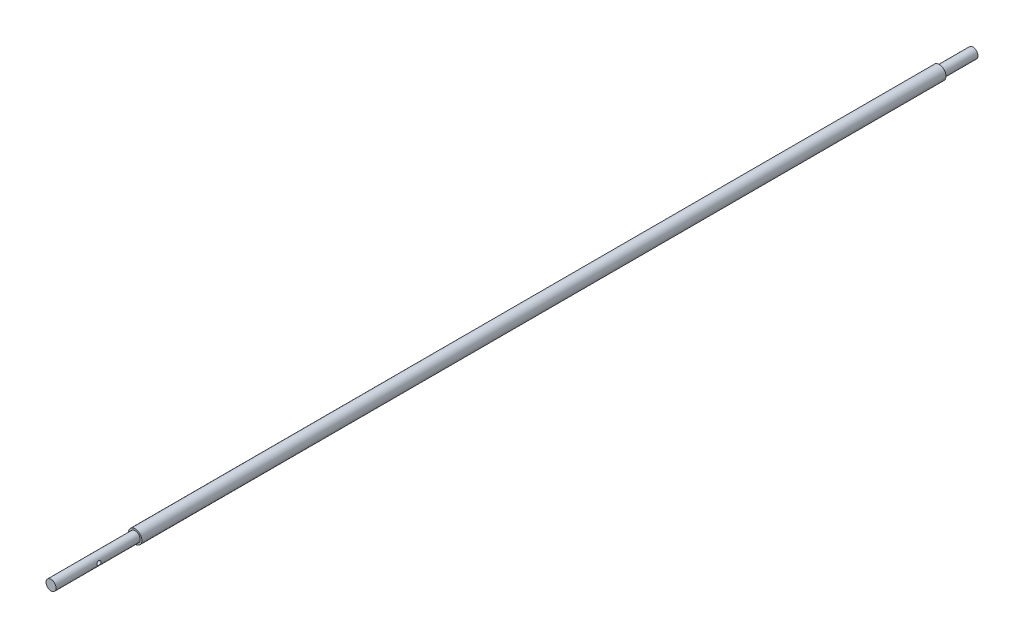
ISO-10303-21;
HEADER;
FILE_DESCRIPTION(('STEP AP214'),'2;1');
FILE_NAME('part.step','',(''),(''),'','','');
FILE_SCHEMA(('AUTOMOTIVE_DESIGN { 1 0 10303 214 1 1 1 1 }'));
ENDSEC;
DATA;
#1=APPLICATION_CONTEXT('core data for automotive mechanical design processes');
#2=APPLICATION_PROTOCOL_DEFINITION('international standard','automotive_design',2000,#1);
#3=PRODUCT_CONTEXT('',#1,'mechanical');
#4=PRODUCT('Part','Part','',(#3));
#5=PRODUCT_RELATED_PRODUCT_CATEGORY('part','',(#4));
#6=PRODUCT_DEFINITION_FORMATION('','',#4);
#7=PRODUCT_DEFINITION_CONTEXT('part definition',#1,'design');
#8=PRODUCT_DEFINITION('design','',#6,#7);
#9=PRODUCT_DEFINITION_SHAPE('','',#8);
#10=(LENGTH_UNIT() NAMED_UNIT(*) SI_UNIT(.MILLI.,.METRE.));
#11=(NAMED_UNIT(*) PLANE_ANGLE_UNIT() SI_UNIT($,.RADIAN.));
#12=(NAMED_UNIT(*) SI_UNIT($,.STERADIAN.) SOLID_ANGLE_UNIT());
#13=UNCERTAINTY_MEASURE_WITH_UNIT(LENGTH_MEASURE(1.E-05),#10,'distance_accuracy_value','');
#14=(GEOMETRIC_REPRESENTATION_CONTEXT(3) GLOBAL_UNCERTAINTY_ASSIGNED_CONTEXT((#13)) GLOBAL_UNIT_ASSIGNED_CONTEXT((#10,
#11,#12)) REPRESENTATION_CONTEXT('',''));
#15=CARTESIAN_POINT('',(0.,0.,0.));
#16=DIRECTION('',(0.,0.,1.));
#17=DIRECTION('',(1.,0.,0.));
#18=AXIS2_PLACEMENT_3D('',#15,#16,#17);
#19=CARTESIAN_POINT('',(0.,0.,90.));
#20=DIRECTION('',(0.,0.,1.));
#21=DIRECTION('',(1.,0.,0.));
#22=AXIS2_PLACEMENT_3D('',#19,#20,#21);
#23=PLANE('',#22);
#24=CARTESIAN_POINT('',(0.,0.,90.));
#25=DIRECTION('',(0.,0.,1.));
#26=DIRECTION('',(1.,0.,0.));
#27=AXIS2_PLACEMENT_3D('',#24,#25,#26);
#28=CIRCLE('',#27,3.);
#29=CARTESIAN_POINT('',(3.,0.,90.));
#30=VERTEX_POINT('',#29);
#31=EDGE_CURVE('E10',#30,#30,#28,.T.);
#32=ORIENTED_EDGE('',*,*,#31,.F.);
#33=EDGE_LOOP('',(#32));
#34=FACE_BOUND('',#33,.T.);
#35=ADVANCED_FACE('F16',(#34),#23,.F.);
#36=CARTESIAN_POINT('',(0.,0.,638.));
#37=DIRECTION('',(0.,0.,1.));
#38=DIRECTION('',(1.,0.,0.));
#39=AXIS2_PLACEMENT_3D('',#36,#37,#38);
#40=PLANE('',#39);
#41=CARTESIAN_POINT('',(0.,0.,638.));
#42=DIRECTION('',(0.,0.,1.));
#43=DIRECTION('',(1.,0.,0.));
#44=AXIS2_PLACEMENT_3D('',#41,#42,#43);
#45=CIRCLE('',#44,3.);
#46=CARTESIAN_POINT('',(3.,0.,638.));
#47=VERTEX_POINT('',#46);
#48=EDGE_CURVE('E50',#47,#47,#45,.T.);
#49=ORIENTED_EDGE('',*,*,#48,.T.);
#50=EDGE_LOOP('',(#49));
#51=FACE_BOUND('',#50,.T.);
#52=ADVANCED_FACE('F85',(#51),#40,.T.);
#53=CARTESIAN_POINT('',(-4.,0.,612.5));
#54=DIRECTION('',(1.,0.,0.));
#55=DIRECTION('',(0.,0.,1.));
#56=AXIS2_PLACEMENT_3D('',#53,#54,#55);
#57=CYLINDRICAL_SURFACE('',#56,1.25);
#58=CARTESIAN_POINT('',(3.,0.,611.25));
#59=CARTESIAN_POINT('',(3.,0.10405855664,611.25));
#60=CARTESIAN_POINT('',(2.995668678032,0.207578761754,611.26039506354));
#61=CARTESIAN_POINT('',(2.987090404886,0.308862616718,611.28098345168));
#62=CARTESIAN_POINT('',(2.974771547846,0.40625817689,611.31108311724));
#63=CARTESIAN_POINT('',(2.959613524117,0.498270751888,611.34953905804));
#64=CARTESIAN_POINT('',(2.935419056328,0.620244067277,611.41394989168));
#65=CARTESIAN_POINT('',(2.927824451843,0.655677243601,611.43451493087));
#66=CARTESIAN_POINT('',(2.919948248371,0.689971815887,611.45626751728));
#67=CARTESIAN_POINT('',(2.911854339085,0.72310091822,611.47912788189));
#68=CARTESIAN_POINT('',(2.903605619736,0.755042154729,611.50301795081));
#69=CARTESIAN_POINT('',(2.889301202292,0.807747989974,611.54561996494));
#70=CARTESIAN_POINT('',(2.883289935293,0.829105444796,611.5638683381));
#71=CARTESIAN_POINT('',(2.877251772947,0.849846247491,611.58258120506));
#72=CARTESIAN_POINT('',(2.871207460048,0.869967719327,611.60173481738));
#73=CARTESIAN_POINT('',(2.86517690089,0.889468219403,611.62130693783));
#74=CARTESIAN_POINT('',(2.84099468743,0.965585903217,611.70182331843));
#75=CARTESIAN_POINT('',(2.823109435877,1.017117648579,611.76603348901));
#76=CARTESIAN_POINT('',(2.80605468137,1.062915744244,611.83333282304));
#77=CARTESIAN_POINT('',(2.790300814279,1.102973119566,611.90322161812));
#78=CARTESIAN_POINT('',(2.776245698278,1.137286301073,611.97526644487));
#79=CARTESIAN_POINT('',(2.752405677325,1.193810943901,612.12141288428));
#80=CARTESIAN_POINT('',(2.74253943855,1.216254269432,612.19544248544));
#81=CARTESIAN_POINT('',(2.734917288729,1.233116524958,612.27073413251));
#82=CARTESIAN_POINT('',(2.729758358236,1.24436951182,612.34686162435));
#83=CARTESIAN_POINT('',(2.727178028659,1.25,612.42341554735));
#84=CARTESIAN_POINT('',(2.727178028659,1.25,612.57634846537));
#85=CARTESIAN_POINT('',(2.729742485352,1.244404156811,612.65266683399));
#86=CARTESIAN_POINT('',(2.734869700352,1.233220323494,612.7285626716));
#87=CARTESIAN_POINT('',(2.742445707314,1.216461606718,612.80363023076));
#88=CARTESIAN_POINT('',(2.752254004449,1.194155926755,612.87744723254));
#89=CARTESIAN_POINT('',(2.77588831852,1.138148224112,613.02275198344));
#90=CARTESIAN_POINT('',(2.789771245621,1.10428453399,613.09418962044));
#91=CARTESIAN_POINT('',(2.805329525126,1.064780127401,613.16351874978));
#92=CARTESIAN_POINT('',(2.822177364176,1.019638708495,613.23031822369));
#93=CARTESIAN_POINT('',(2.839858880133,0.968867277184,613.29410343231));
#94=CARTESIAN_POINT('',(2.863724645697,0.894121363379,613.37393902603));
#95=CARTESIAN_POINT('',(2.869624158386,0.875155561207,613.3931815796));
#96=CARTESIAN_POINT('',(2.875539999225,0.855594463398,613.41202652856));
#97=CARTESIAN_POINT('',(2.881453597387,0.835439504369,613.43045318822));
#98=CARTESIAN_POINT('',(2.887345610505,0.814693024083,613.44843950129));
#99=CARTESIAN_POINT('',(2.901637450668,0.762573955836,613.49124562834));
#100=CARTESIAN_POINT('',(2.909994135353,0.730558635055,613.51556882866));
#101=CARTESIAN_POINT('',(2.918202745582,0.697329643253,613.5388539967));
#102=CARTESIAN_POINT('',(2.926198887126,0.662908859614,613.56102153745));
#103=CARTESIAN_POINT('',(2.933917004671,0.627322704958,613.58198990289));
#104=CARTESIAN_POINT('',(2.958591865776,0.504438064841,613.64786767323));
#105=CARTESIAN_POINT('',(2.97410719224,0.411476513855,613.6872928348));
#106=CARTESIAN_POINT('',(2.986741646582,0.312941159151,613.71817947631));
#107=CARTESIAN_POINT('',(2.995550192238,0.210371144807,613.73932058413));
#108=CARTESIAN_POINT('',(3.,0.105472199801,613.75));
#109=CARTESIAN_POINT('',(3.,0.,613.75));
#110=B_SPLINE_CURVE_WITH_KNOTS('',6,(#58,#59,#60,#61,#62,#63,#64,#65,#66,#67,#68,#69,#70,#71,
#72,#73,#74,#75,#76,#77,#78,#79,#80,#81,#82,#83,#84,#85,#86,#87,#88,#89,#90,#91,#92,#93,#94,#95,
#96,#97,#98,#99,#100,#101,#102,#103,#104,#105,#106,#107,#108,#109),.UNSPECIFIED.,.F.,.F.,(7,5,5,
5,5,5,5,5,5,5,7),(0.,0.140118359721,0.200048303248,0.242887580874,0.372771408334,0.500009433662,
0.626855387833,0.755558398587,0.797495998108,0.858008532435,1.),.UNSPECIFIED.);
#111=CARTESIAN_POINT('',(3.,0.,611.25));
#112=VERTEX_POINT('',#111);
#113=CARTESIAN_POINT('',(3.,0.,613.75));
#114=VERTEX_POINT('',#113);
#115=EDGE_CURVE('E19',#112,#114,#110,.T.);
#116=ORIENTED_EDGE('',*,*,#115,.T.);
#117=CARTESIAN_POINT('',(3.,0.,613.75));
#118=CARTESIAN_POINT('',(3.,-0.10405855664,613.75));
#119=CARTESIAN_POINT('',(2.995668678032,-0.207578761754,613.73960493646));
#120=CARTESIAN_POINT('',(2.987090404886,-0.308862616717,613.71901654831));
#121=CARTESIAN_POINT('',(2.974771547846,-0.40625817689,613.68891688275));
#122=CARTESIAN_POINT('',(2.959613524117,-0.498270751888,613.65046094195));
#123=CARTESIAN_POINT('',(2.935419056328,-0.620244067277,613.58605010831));
#124=CARTESIAN_POINT('',(2.927824451843,-0.655677243601,613.56548506912));
#125=CARTESIAN_POINT('',(2.919948248371,-0.689971815887,613.54373248271));
#126=CARTESIAN_POINT('',(2.911854339085,-0.72310091822,613.5208721181));
#127=CARTESIAN_POINT('',(2.903605619736,-0.755042154729,613.49698204918));
#128=CARTESIAN_POINT('',(2.889301202292,-0.807747989974,613.45438003505));
#129=CARTESIAN_POINT('',(2.883289935293,-0.829105444796,613.43613166189));
#130=CARTESIAN_POINT('',(2.877251772947,-0.849846247491,613.41741879493));
#131=CARTESIAN_POINT('',(2.871207460048,-0.869967719327,613.39826518261));
#132=CARTESIAN_POINT('',(2.86517690089,-0.889468219403,613.37869306216));
#133=CARTESIAN_POINT('',(2.84099468743,-0.965585903217,613.29817668156));
#134=CARTESIAN_POINT('',(2.823109435877,-1.017117648579,613.23396651098));
#135=CARTESIAN_POINT('',(2.80605468137,-1.062915744244,613.16666717695));
#136=CARTESIAN_POINT('',(2.790300814279,-1.102973119566,613.09677838187));
#137=CARTESIAN_POINT('',(2.776245698278,-1.137286301073,613.02473355512));
#138=CARTESIAN_POINT('',(2.752405677325,-1.193810943901,612.87858711571));
#139=CARTESIAN_POINT('',(2.74253943855,-1.216254269432,612.80455751455));
#140=CARTESIAN_POINT('',(2.734917288729,-1.233116524958,612.72926586748));
#141=CARTESIAN_POINT('',(2.729758358236,-1.24436951182,612.65313837565));
#142=CARTESIAN_POINT('',(2.727178028659,-1.25,612.57658445264));
#143=CARTESIAN_POINT('',(2.727178028659,-1.25,612.42365153463));
#144=CARTESIAN_POINT('',(2.729742485352,-1.244404156811,612.347333166));
#145=CARTESIAN_POINT('',(2.734869700352,-1.233220323494,612.27143732839));
#146=CARTESIAN_POINT('',(2.742445707314,-1.216461606718,612.19636976923));
#147=CARTESIAN_POINT('',(2.752254004449,-1.194155926755,612.12255276745));
#148=CARTESIAN_POINT('',(2.77588831852,-1.138148224112,611.97724801655));
#149=CARTESIAN_POINT('',(2.789771245621,-1.10428453399,611.90581037955));
#150=CARTESIAN_POINT('',(2.805329525126,-1.064780127401,611.83648125021));
#151=CARTESIAN_POINT('',(2.822177364176,-1.019638708495,611.7696817763));
#152=CARTESIAN_POINT('',(2.839858880133,-0.968867277184,611.70589656768));
#153=CARTESIAN_POINT('',(2.863724645697,-0.894121363379,611.62606097396));
#154=CARTESIAN_POINT('',(2.869624158386,-0.875155561207,611.60681842039));
#155=CARTESIAN_POINT('',(2.875539999225,-0.855594463398,611.58797347143));
#156=CARTESIAN_POINT('',(2.881453597387,-0.835439504369,611.56954681177));
#157=CARTESIAN_POINT('',(2.887345610505,-0.814693024083,611.5515604987));
#158=CARTESIAN_POINT('',(2.901637450668,-0.762573955836,611.50875437165));
#159=CARTESIAN_POINT('',(2.909994135353,-0.730558635056,611.48443117134));
#160=CARTESIAN_POINT('',(2.918202745582,-0.697329643253,611.46114600329));
#161=CARTESIAN_POINT('',(2.926198887126,-0.662908859614,611.43897846254));
#162=CARTESIAN_POINT('',(2.933917004671,-0.627322704958,611.4180100971));
#163=CARTESIAN_POINT('',(2.958591865776,-0.504438064841,611.35213232676));
#164=CARTESIAN_POINT('',(2.97410719224,-0.411476513855,611.31270716519));
#165=CARTESIAN_POINT('',(2.986741646582,-0.312941159151,611.28182052368));
#166=CARTESIAN_POINT('',(2.995550192238,-0.210371144807,611.26067941586));
#167=CARTESIAN_POINT('',(3.,-0.105472199801,611.25));
#168=CARTESIAN_POINT('',(3.,0.,611.25));
#169=B_SPLINE_CURVE_WITH_KNOTS('',6,(#117,#118,#119,#120,#121,#122,#123,#124,#125,#126,#127,
#128,#129,#130,#131,#132,#133,#134,#135,#136,#137,#138,#139,#140,#141,#142,#143,#144,#145,#146,
#147,#148,#149,#150,#151,#152,#153,#154,#155,#156,#157,#158,#159,#160,#161,#162,#163,#164,#165,
#166,#167,#168),.UNSPECIFIED.,.F.,.F.,(7,5,5,5,5,5,5,5,5,5,7),(0.,0.14011835972,0.200048303248,
0.242887580874,0.372771408333,0.500009433661,0.626855387832,0.755558398587,0.797495998108,
0.858008532435,1.),.UNSPECIFIED.);
#170=EDGE_CURVE('E39',#114,#112,#169,.T.);
#171=ORIENTED_EDGE('',*,*,#170,.T.);
#172=EDGE_LOOP('',(#116,#171));
#173=FACE_BOUND('',#172,.T.);
#174=CARTESIAN_POINT('',(-3.,0.,613.75));
#175=CARTESIAN_POINT('',(-3.,-0.10405855664,613.75));
#176=CARTESIAN_POINT('',(-2.995668678032,-0.207578761754,613.73960493646));
#177=CARTESIAN_POINT('',(-2.987090404886,-0.308862616718,613.71901654831));
#178=CARTESIAN_POINT('',(-2.974771547846,-0.40625817689,613.68891688275));
#179=CARTESIAN_POINT('',(-2.959613524117,-0.498270751888,613.65046094195));
#180=CARTESIAN_POINT('',(-2.935419056328,-0.620244067277,613.58605010831));
#181=CARTESIAN_POINT('',(-2.927824451843,-0.655677243601,613.56548506912));
#182=CARTESIAN_POINT('',(-2.919948248371,-0.689971815887,613.54373248271));
#183=CARTESIAN_POINT('',(-2.911854339085,-0.72310091822,613.5208721181));
#184=CARTESIAN_POINT('',(-2.903605619736,-0.755042154729,613.49698204918));
#185=CARTESIAN_POINT('',(-2.889301202292,-0.807747989974,613.45438003505));
#186=CARTESIAN_POINT('',(-2.883289935293,-0.829105444796,613.43613166189));
#187=CARTESIAN_POINT('',(-2.877251772947,-0.849846247491,613.41741879493));
#188=CARTESIAN_POINT('',(-2.871207460048,-0.869967719327,613.39826518261));
#189=CARTESIAN_POINT('',(-2.86517690089,-0.889468219403,613.37869306216));
#190=CARTESIAN_POINT('',(-2.84099468743,-0.965585903217,613.29817668156));
#191=CARTESIAN_POINT('',(-2.823109435877,-1.017117648579,613.23396651098));
#192=CARTESIAN_POINT('',(-2.80605468137,-1.062915744244,613.16666717695));
#193=CARTESIAN_POINT('',(-2.790300814279,-1.102973119566,613.09677838187));
#194=CARTESIAN_POINT('',(-2.776245698278,-1.137286301073,613.02473355512));
#195=CARTESIAN_POINT('',(-2.752405677325,-1.193810943901,612.87858711571));
#196=CARTESIAN_POINT('',(-2.74253943855,-1.216254269432,612.80455751455));
#197=CARTESIAN_POINT('',(-2.734917288729,-1.233116524958,612.72926586748));
#198=CARTESIAN_POINT('',(-2.729758358236,-1.24436951182,612.65313837565));
#199=CARTESIAN_POINT('',(-2.727178028659,-1.25,612.57658445264));
#200=CARTESIAN_POINT('',(-2.727178028659,-1.25,612.42365153463));
#201=CARTESIAN_POINT('',(-2.729742485352,-1.244404156811,612.347333166));
#202=CARTESIAN_POINT('',(-2.734869700352,-1.233220323494,612.27143732839));
#203=CARTESIAN_POINT('',(-2.742445707314,-1.216461606718,612.19636976923));
#204=CARTESIAN_POINT('',(-2.752254004449,-1.194155926755,612.12255276745));
#205=CARTESIAN_POINT('',(-2.77588831852,-1.138148224112,611.97724801655));
#206=CARTESIAN_POINT('',(-2.789771245621,-1.10428453399,611.90581037955));
#207=CARTESIAN_POINT('',(-2.805329525126,-1.064780127401,611.83648125021));
#208=CARTESIAN_POINT('',(-2.822177364176,-1.019638708495,611.7696817763));
#209=CARTESIAN_POINT('',(-2.839858880133,-0.968867277184,611.70589656768));
#210=CARTESIAN_POINT('',(-2.863724645697,-0.894121363379,611.62606097396));
#211=CARTESIAN_POINT('',(-2.869624158386,-0.875155561207,611.60681842039));
#212=CARTESIAN_POINT('',(-2.875539999225,-0.855594463398,611.58797347143));
#213=CARTESIAN_POINT('',(-2.881453597387,-0.835439504369,611.56954681177));
#214=CARTESIAN_POINT('',(-2.887345610505,-0.814693024083,611.5515604987));
#215=CARTESIAN_POINT('',(-2.901637450668,-0.762573955836,611.50875437165));
#216=CARTESIAN_POINT('',(-2.909994135353,-0.730558635056,611.48443117134));
#217=CARTESIAN_POINT('',(-2.918202745582,-0.697329643253,611.46114600329));
#218=CARTESIAN_POINT('',(-2.926198887126,-0.662908859614,611.43897846254));
#219=CARTESIAN_POINT('',(-2.933917004671,-0.627322704958,611.4180100971));
#220=CARTESIAN_POINT('',(-2.951384612282,-0.54033130647,611.37137449345));
#221=CARTESIAN_POINT('',(-2.960842532191,-0.487887893258,611.34680378033));
#222=CARTESIAN_POINT('',(-2.969469201172,-0.43345821638,611.32489595501));
#223=CARTESIAN_POINT('',(-2.977082817015,-0.37725544697,611.30589746762));
#224=CARTESIAN_POINT('',(-2.983524628994,-0.3195161193,611.29002029161));
#225=CARTESIAN_POINT('',(-2.997919523909,-0.154363990915,611.25483041229));
#226=CARTESIAN_POINT('',(-3.002957444401,-0.0442804536154,611.24293264242));
#227=CARTESIAN_POINT('',(-3.003001368792,0.06735995195145,611.24291255917));
#228=CARTESIAN_POINT('',(-2.997868715639,0.177970587373,611.25493975076));
#229=CARTESIAN_POINT('',(-2.98817512837,0.285016958155,611.27827984316));
#230=CARTESIAN_POINT('',(-2.965229820401,0.461739782345,611.33570056952));
#231=CARTESIAN_POINT('',(-2.953501708407,0.534076839954,611.36556040277));
#232=CARTESIAN_POINT('',(-2.940220349082,0.60291706337,611.40024073057));
#233=CARTESIAN_POINT('',(-2.925803737866,0.667960270813,611.439215938));
#234=CARTESIAN_POINT('',(-2.910681378411,0.728970923766,611.48194463047));
#235=CARTESIAN_POINT('',(-2.889301202292,0.807747989974,611.54561996494));
#236=CARTESIAN_POINT('',(-2.883289935293,0.829105444796,611.5638683381));
#237=CARTESIAN_POINT('',(-2.877251772947,0.849846247491,611.58258120506));
#238=CARTESIAN_POINT('',(-2.871207460048,0.869967719327,611.60173481738));
#239=CARTESIAN_POINT('',(-2.86517690089,0.889468219403,611.62130693783));
#240=CARTESIAN_POINT('',(-2.84099468743,0.965585903217,611.70182331843));
#241=CARTESIAN_POINT('',(-2.823109435877,1.017117648579,611.76603348901));
#242=CARTESIAN_POINT('',(-2.80605468137,1.062915744244,611.83333282304));
#243=CARTESIAN_POINT('',(-2.790300814279,1.102973119566,611.90322161812));
#244=CARTESIAN_POINT('',(-2.776245698278,1.137286301073,611.97526644487));
#245=CARTESIAN_POINT('',(-2.752405677325,1.193810943901,612.12141288428));
#246=CARTESIAN_POINT('',(-2.74253943855,1.216254269432,612.19544248544));
#247=CARTESIAN_POINT('',(-2.734917288729,1.233116524958,612.27073413251));
#248=CARTESIAN_POINT('',(-2.729758358236,1.24436951182,612.34686162435));
#249=CARTESIAN_POINT('',(-2.727178028659,1.25,612.42341554735));
#250=CARTESIAN_POINT('',(-2.727178028659,1.25,612.57634846537));
#251=CARTESIAN_POINT('',(-2.729742485352,1.244404156811,612.65266683399));
#252=CARTESIAN_POINT('',(-2.734869700352,1.233220323494,612.7285626716));
#253=CARTESIAN_POINT('',(-2.742445707314,1.216461606718,612.80363023076));
#254=CARTESIAN_POINT('',(-2.752254004449,1.194155926755,612.87744723254));
#255=CARTESIAN_POINT('',(-2.77588831852,1.138148224112,613.02275198344));
#256=CARTESIAN_POINT('',(-2.789771245621,1.10428453399,613.09418962044));
#257=CARTESIAN_POINT('',(-2.805329525126,1.064780127401,613.16351874978));
#258=CARTESIAN_POINT('',(-2.822177364176,1.019638708495,613.23031822369));
#259=CARTESIAN_POINT('',(-2.839858880133,0.968867277183,613.29410343231));
#260=CARTESIAN_POINT('',(-2.863724645697,0.894121363379,613.37393902603));
#261=CARTESIAN_POINT('',(-2.869624158386,0.875155561207,613.3931815796));
#262=CARTESIAN_POINT('',(-2.875539999225,0.855594463398,613.41202652856));
#263=CARTESIAN_POINT('',(-2.881453597387,0.835439504369,613.43045318822));
#264=CARTESIAN_POINT('',(-2.887345610505,0.814693024083,613.44843950129));
#265=CARTESIAN_POINT('',(-2.901637450668,0.762573955836,613.49124562834));
#266=CARTESIAN_POINT('',(-2.909994135353,0.730558635055,613.51556882866));
#267=CARTESIAN_POINT('',(-2.918202745582,0.697329643253,613.5388539967));
#268=CARTESIAN_POINT('',(-2.926198887126,0.662908859614,613.56102153745));
#269=CARTESIAN_POINT('',(-2.933917004671,0.627322704958,613.58198990289));
#270=CARTESIAN_POINT('',(-2.958591865776,0.504438064841,613.64786767323));
#271=CARTESIAN_POINT('',(-2.97410719224,0.411476513855,613.6872928348));
#272=CARTESIAN_POINT('',(-2.986741646582,0.312941159152,613.71817947631));
#273=CARTESIAN_POINT('',(-2.995550192238,0.210371144806,613.73932058413));
#274=CARTESIAN_POINT('',(-3.,0.105472199801,613.75));
#275=CARTESIAN_POINT('',(-3.,0.,613.75));
#276=B_SPLINE_CURVE_WITH_KNOTS('',6,(#174,#175,#176,#177,#178,#179,#180,#181,#182,#183,#184,
#185,#186,#187,#188,#189,#190,#191,#192,#193,#194,#195,#196,#197,#198,#199,#200,#201,#202,#203,
#204,#205,#206,#207,#208,#209,#210,#211,#212,#213,#214,#215,#216,#217,#218,#219,#220,#221,#222,
#223,#224,#225,#226,#227,#228,#229,#230,#231,#232,#233,#234,#235,#236,#237,#238,#239,#240,#241,
#242,#243,#244,#245,#246,#247,#248,#249,#250,#251,#252,#253,#254,#255,#256,#257,#258,#259,#260,
#261,#262,#263,#264,#265,#266,#267,#268,#269,#270,#271,#272,#273,#274,#275),.UNSPECIFIED.,.T.,
.F.,(7,5,5,5,5,5,5,5,5,5,5,5,5,5,5,5,5,5,5,5,7),(0.,0.06996283529436,0.09988659957886,
0.121276782355,0.186129388723,0.249660913264,0.312996671812,0.377259681751,0.398199645463,
0.428414304561,0.469778489017,0.544162237997,0.599603179574,0.621045362422,0.686055627105,
0.749741598377,0.813231327745,0.877650562674,0.898641431964,0.928929543657,1.),.UNSPECIFIED.);
#277=CARTESIAN_POINT('',(-3.,0.,613.75));
#278=VERTEX_POINT('',#277);
#279=EDGE_CURVE('E28',#278,#278,#276,.T.);
#280=ORIENTED_EDGE('',*,*,#279,.F.);
#281=EDGE_LOOP('',(#280));
#282=FACE_BOUND('',#281,.T.);
#283=ADVANCED_FACE('F47',(#173,#282),#57,.F.);
#284=CARTESIAN_POINT('',(0.,0.,90.));
#285=DIRECTION('',(0.,0.,1.));
#286=DIRECTION('',(1.,0.,0.));
#287=AXIS2_PLACEMENT_3D('',#284,#285,#286);
#288=CYLINDRICAL_SURFACE('',#287,3.);
#289=CARTESIAN_POINT('',(0.,0.,110.));
#290=DIRECTION('',(0.,0.,1.));
#291=DIRECTION('',(1.,0.,0.));
#292=AXIS2_PLACEMENT_3D('',#289,#290,#291);
#293=CIRCLE('',#292,3.);
#294=CARTESIAN_POINT('',(3.,0.,110.));
#295=VERTEX_POINT('',#294);
#296=EDGE_CURVE('E54',#295,#295,#293,.T.);
#297=ORIENTED_EDGE('',*,*,#296,.F.);
#298=EDGE_LOOP('',(#297));
#299=FACE_BOUND('',#298,.T.);
#300=ORIENTED_EDGE('',*,*,#31,.T.);
#301=EDGE_LOOP('',(#300));
#302=FACE_BOUND('',#301,.T.);
#303=ADVANCED_FACE('F84',(#299,#302),#288,.T.);
#304=CARTESIAN_POINT('',(0.,0.,588.));
#305=DIRECTION('',(0.,0.,1.));
#306=DIRECTION('',(1.,0.,0.));
#307=AXIS2_PLACEMENT_3D('',#304,#305,#306);
#308=CYLINDRICAL_SURFACE('',#307,3.);
#309=ORIENTED_EDGE('',*,*,#48,.F.);
#310=EDGE_LOOP('',(#309));
#311=FACE_BOUND('',#310,.T.);
#312=ORIENTED_EDGE('',*,*,#115,.F.);
#313=ORIENTED_EDGE('',*,*,#170,.F.);
#314=EDGE_LOOP('',(#312,#313));
#315=FACE_BOUND('',#314,.T.);
#316=ORIENTED_EDGE('',*,*,#279,.T.);
#317=EDGE_LOOP('',(#316));
#318=FACE_BOUND('',#317,.T.);
#319=CARTESIAN_POINT('',(0.,0.,588.));
#320=DIRECTION('',(0.,0.,1.));
#321=DIRECTION('',(1.,0.,0.));
#322=AXIS2_PLACEMENT_3D('',#319,#320,#321);
#323=CIRCLE('',#322,3.);
#324=CARTESIAN_POINT('',(3.,0.,588.));
#325=VERTEX_POINT('',#324);
#326=EDGE_CURVE('E62',#325,#325,#323,.T.);
#327=ORIENTED_EDGE('',*,*,#326,.T.);
#328=EDGE_LOOP('',(#327));
#329=FACE_BOUND('',#328,.T.);
#330=ADVANCED_FACE('F44',(#311,#315,#318,#329),#308,.T.);
#331=CARTESIAN_POINT('',(0.,0.,110.));
#332=DIRECTION('',(0.,0.,1.));
#333=DIRECTION('',(1.,0.,0.));
#334=AXIS2_PLACEMENT_3D('',#331,#332,#333);
#335=PLANE('',#334);
#336=ORIENTED_EDGE('',*,*,#296,.T.);
#337=EDGE_LOOP('',(#336));
#338=FACE_BOUND('',#337,.T.);
#339=CARTESIAN_POINT('',(0.,0.,110.));
#340=DIRECTION('',(0.,0.,1.));
#341=DIRECTION('',(1.,0.,0.));
#342=AXIS2_PLACEMENT_3D('',#339,#340,#341);
#343=CIRCLE('',#342,4.);
#344=CARTESIAN_POINT('',(4.,0.,110.));
#345=VERTEX_POINT('',#344);
#346=EDGE_CURVE('E169',#345,#345,#343,.T.);
#347=ORIENTED_EDGE('',*,*,#346,.F.);
#348=EDGE_LOOP('',(#347));
#349=FACE_BOUND('',#348,.T.);
#350=ADVANCED_FACE('F129',(#338,#349),#335,.F.);
#351=CARTESIAN_POINT('',(0.,0.,588.));
#352=DIRECTION('',(0.,0.,1.));
#353=DIRECTION('',(1.,0.,0.));
#354=AXIS2_PLACEMENT_3D('',#351,#352,#353);
#355=PLANE('',#354);
#356=ORIENTED_EDGE('',*,*,#326,.F.);
#357=EDGE_LOOP('',(#356));
#358=FACE_BOUND('',#357,.T.);
#359=CARTESIAN_POINT('',(0.,0.,588.));
#360=DIRECTION('',(0.,0.,1.));
#361=DIRECTION('',(1.,0.,0.));
#362=AXIS2_PLACEMENT_3D('',#359,#360,#361);
#363=CIRCLE('',#362,4.);
#364=CARTESIAN_POINT('',(4.,0.,588.));
#365=VERTEX_POINT('',#364);
#366=EDGE_CURVE('E166',#365,#365,#363,.T.);
#367=ORIENTED_EDGE('',*,*,#366,.T.);
#368=EDGE_LOOP('',(#367));
#369=FACE_BOUND('',#368,.T.);
#370=ADVANCED_FACE('F140',(#358,#369),#355,.T.);
#371=CARTESIAN_POINT('',(0.,0.,110.));
#372=DIRECTION('',(0.,0.,1.));
#373=DIRECTION('',(1.,0.,0.));
#374=AXIS2_PLACEMENT_3D('',#371,#372,#373);
#375=CYLINDRICAL_SURFACE('',#374,4.);
#376=ORIENTED_EDGE('',*,*,#366,.F.);
#377=EDGE_LOOP('',(#376));
#378=FACE_BOUND('',#377,.T.);
#379=ORIENTED_EDGE('',*,*,#346,.T.);
#380=EDGE_LOOP('',(#379));
#381=FACE_BOUND('',#380,.T.);
#382=ADVANCED_FACE('F149',(#378,#381),#375,.T.);
#383=CLOSED_SHELL('',(#35,#52,#283,#303,#330,#350,#370,#382));
#384=MANIFOLD_SOLID_BREP('B1',#383);
#385=ADVANCED_BREP_SHAPE_REPRESENTATION('',(#18,#384),#14);
#386=SHAPE_DEFINITION_REPRESENTATION(#9,#385);
ENDSEC;
END-ISO-10303-21;
